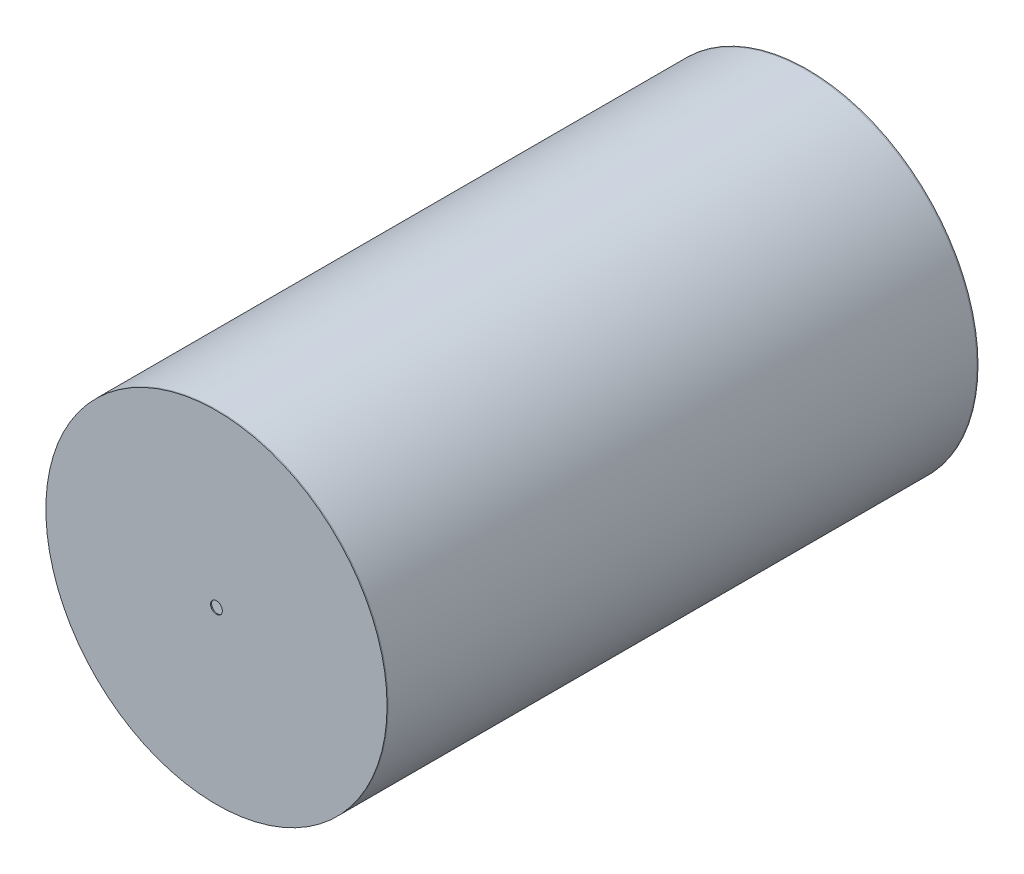
ISO-10303-21;
HEADER;
FILE_DESCRIPTION(('STEP AP214'),'2;1');
FILE_NAME('part.step','',(''),(''),'','','');
FILE_SCHEMA(('AUTOMOTIVE_DESIGN { 1 0 10303 214 1 1 1 1 }'));
ENDSEC;
DATA;
#1=APPLICATION_CONTEXT('core data for automotive mechanical design processes');
#2=APPLICATION_PROTOCOL_DEFINITION('international standard','automotive_design',2000,#1);
#3=PRODUCT_CONTEXT('',#1,'mechanical');
#4=PRODUCT('Part','Part','',(#3));
#5=PRODUCT_RELATED_PRODUCT_CATEGORY('part','',(#4));
#6=PRODUCT_DEFINITION_FORMATION('','',#4);
#7=PRODUCT_DEFINITION_CONTEXT('part definition',#1,'design');
#8=PRODUCT_DEFINITION('design','',#6,#7);
#9=PRODUCT_DEFINITION_SHAPE('','',#8);
#10=(LENGTH_UNIT() NAMED_UNIT(*) SI_UNIT(.MILLI.,.METRE.));
#11=(NAMED_UNIT(*) PLANE_ANGLE_UNIT() SI_UNIT($,.RADIAN.));
#12=(NAMED_UNIT(*) SI_UNIT($,.STERADIAN.) SOLID_ANGLE_UNIT());
#13=UNCERTAINTY_MEASURE_WITH_UNIT(LENGTH_MEASURE(1.E-05),#10,'distance_accuracy_value','');
#14=(GEOMETRIC_REPRESENTATION_CONTEXT(3) GLOBAL_UNCERTAINTY_ASSIGNED_CONTEXT((#13)) GLOBAL_UNIT_ASSIGNED_CONTEXT((#10,
#11,#12)) REPRESENTATION_CONTEXT('',''));
#15=CARTESIAN_POINT('',(0.,0.,0.));
#16=DIRECTION('',(0.,0.,1.));
#17=DIRECTION('',(1.,0.,0.));
#18=AXIS2_PLACEMENT_3D('',#15,#16,#17);
#19=CARTESIAN_POINT('',(0.,0.,1149.92));
#20=DIRECTION('',(0.,0.,-1.));
#21=DIRECTION('',(-1.,0.,0.));
#22=AXIS2_PLACEMENT_3D('',#19,#20,#21);
#23=CYLINDRICAL_SURFACE('',#22,332.);
#24=CARTESIAN_POINT('',(0.,0.,1149.92));
#25=DIRECTION('',(0.,0.,1.));
#26=DIRECTION('',(1.,0.,0.));
#27=AXIS2_PLACEMENT_3D('',#24,#25,#26);
#28=CIRCLE('',#27,332.);
#29=CARTESIAN_POINT('',(332.,0.,1149.92));
#30=VERTEX_POINT('',#29);
#31=EDGE_CURVE('E11',#30,#30,#28,.T.);
#32=ORIENTED_EDGE('',*,*,#31,.F.);
#33=EDGE_LOOP('',(#32));
#34=FACE_BOUND('',#33,.T.);
#35=CARTESIAN_POINT('',(0.,0.,1147.92));
#36=DIRECTION('',(0.,0.,1.));
#37=DIRECTION('',(1.,0.,0.));
#38=AXIS2_PLACEMENT_3D('',#35,#36,#37);
#39=CIRCLE('',#38,332.);
#40=CARTESIAN_POINT('',(332.,0.,1147.92));
#41=VERTEX_POINT('',#40);
#42=EDGE_CURVE('E43',#41,#41,#39,.T.);
#43=ORIENTED_EDGE('',*,*,#42,.T.);
#44=EDGE_LOOP('',(#43));
#45=FACE_BOUND('',#44,.T.);
#46=ADVANCED_FACE('F40',(#34,#45),#23,.T.);
#47=CARTESIAN_POINT('',(0.,0.,1149.92));
#48=DIRECTION('',(0.,0.,1.));
#49=DIRECTION('',(1.,0.,0.));
#50=AXIS2_PLACEMENT_3D('',#47,#48,#49);
#51=PLANE('',#50);
#52=CARTESIAN_POINT('',(0.,0.,1149.92));
#53=DIRECTION('',(0.,0.,1.));
#54=DIRECTION('',(1.,0.,0.));
#55=AXIS2_PLACEMENT_3D('',#52,#53,#54);
#56=CIRCLE('',#55,11.45);
#57=CARTESIAN_POINT('',(11.45,0.,1149.92));
#58=VERTEX_POINT('',#57);
#59=EDGE_CURVE('E54',#58,#58,#56,.T.);
#60=ORIENTED_EDGE('',*,*,#59,.F.);
#61=EDGE_LOOP('',(#60));
#62=FACE_BOUND('',#61,.T.);
#63=ORIENTED_EDGE('',*,*,#31,.T.);
#64=EDGE_LOOP('',(#63));
#65=FACE_BOUND('',#64,.T.);
#66=ADVANCED_FACE('F61',(#62,#65),#51,.T.);
#67=CARTESIAN_POINT('',(0.,0.,1147.92));
#68=DIRECTION('',(0.,0.,1.));
#69=DIRECTION('',(1.,0.,0.));
#70=AXIS2_PLACEMENT_3D('',#67,#68,#69);
#71=PLANE('',#70);
#72=CARTESIAN_POINT('',(0.,0.,1147.92));
#73=DIRECTION('',(0.,0.,1.));
#74=DIRECTION('',(1.,0.,0.));
#75=AXIS2_PLACEMENT_3D('',#72,#73,#74);
#76=CIRCLE('',#75,11.45);
#77=CARTESIAN_POINT('',(11.45,0.,1147.92));
#78=VERTEX_POINT('',#77);
#79=EDGE_CURVE('E50',#78,#78,#76,.F.);
#80=ORIENTED_EDGE('',*,*,#79,.F.);
#81=EDGE_LOOP('',(#80));
#82=FACE_BOUND('',#81,.T.);
#83=ORIENTED_EDGE('',*,*,#42,.F.);
#84=EDGE_LOOP('',(#83));
#85=FACE_BOUND('',#84,.T.);
#86=ADVANCED_FACE('F63',(#82,#85),#71,.F.);
#87=CARTESIAN_POINT('',(0.,0.,-0.000999999999917733));
#88=DIRECTION('',(0.,0.,1.));
#89=DIRECTION('',(1.,0.,0.));
#90=AXIS2_PLACEMENT_3D('',#87,#88,#89);
#91=CYLINDRICAL_SURFACE('',#90,11.45);
#92=ORIENTED_EDGE('',*,*,#59,.T.);
#93=EDGE_LOOP('',(#92));
#94=FACE_BOUND('',#93,.T.);
#95=ORIENTED_EDGE('',*,*,#79,.T.);
#96=EDGE_LOOP('',(#95));
#97=FACE_BOUND('',#96,.T.);
#98=ADVANCED_FACE('F58',(#94,#97),#91,.F.);
#99=CLOSED_SHELL('',(#46,#66,#86,#98));
#100=MANIFOLD_SOLID_BREP('B2',#99);
#101=CARTESIAN_POINT('',(0.,0.,1147.92));
#102=DIRECTION('',(0.,0.,1.));
#103=DIRECTION('',(1.,0.,0.));
#104=AXIS2_PLACEMENT_3D('',#101,#102,#103);
#105=PLANE('',#104);
#106=CARTESIAN_POINT('',(0.,0.,1147.92));
#107=DIRECTION('',(0.,0.,1.));
#108=DIRECTION('',(1.,0.,0.));
#109=AXIS2_PLACEMENT_3D('',#106,#107,#108);
#110=CIRCLE('',#109,332.);
#111=CARTESIAN_POINT('',(332.,0.,1147.92));
#112=VERTEX_POINT('',#111);
#113=EDGE_CURVE('E39',#112,#112,#110,.T.);
#114=ORIENTED_EDGE('',*,*,#113,.T.);
#115=EDGE_LOOP('',(#114));
#116=FACE_BOUND('',#115,.T.);
#117=CARTESIAN_POINT('',(0.,0.,1147.92));
#118=DIRECTION('',(0.,0.,1.));
#119=DIRECTION('',(1.,0.,0.));
#120=AXIS2_PLACEMENT_3D('',#117,#118,#119);
#121=CIRCLE('',#120,330.);
#122=CARTESIAN_POINT('',(330.,0.,1147.92));
#123=VERTEX_POINT('',#122);
#124=EDGE_CURVE('E120',#123,#123,#121,.T.);
#125=ORIENTED_EDGE('',*,*,#124,.F.);
#126=EDGE_LOOP('',(#125));
#127=FACE_BOUND('',#126,.T.);
#128=ADVANCED_FACE('F109',(#116,#127),#105,.T.);
#129=CARTESIAN_POINT('',(0.,0.,2.));
#130=DIRECTION('',(0.,0.,1.));
#131=DIRECTION('',(1.,0.,0.));
#132=AXIS2_PLACEMENT_3D('',#129,#130,#131);
#133=PLANE('',#132);
#134=CARTESIAN_POINT('',(0.,0.,2.));
#135=DIRECTION('',(0.,0.,1.));
#136=DIRECTION('',(1.,0.,0.));
#137=AXIS2_PLACEMENT_3D('',#134,#135,#136);
#138=CIRCLE('',#137,332.);
#139=CARTESIAN_POINT('',(332.,0.,2.));
#140=VERTEX_POINT('',#139);
#141=EDGE_CURVE('E113',#140,#140,#138,.T.);
#142=ORIENTED_EDGE('',*,*,#141,.F.);
#143=EDGE_LOOP('',(#142));
#144=FACE_BOUND('',#143,.T.);
#145=CARTESIAN_POINT('',(0.,0.,2.));
#146=DIRECTION('',(0.,0.,1.));
#147=DIRECTION('',(1.,0.,0.));
#148=AXIS2_PLACEMENT_3D('',#145,#146,#147);
#149=CIRCLE('',#148,330.);
#150=CARTESIAN_POINT('',(330.,0.,2.));
#151=VERTEX_POINT('',#150);
#152=EDGE_CURVE('E122',#151,#151,#149,.T.);
#153=ORIENTED_EDGE('',*,*,#152,.T.);
#154=EDGE_LOOP('',(#153));
#155=FACE_BOUND('',#154,.T.);
#156=ADVANCED_FACE('F132',(#144,#155),#133,.F.);
#157=CARTESIAN_POINT('',(0.,0.,1147.92));
#158=DIRECTION('',(0.,0.,-1.));
#159=DIRECTION('',(-1.,0.,0.));
#160=AXIS2_PLACEMENT_3D('',#157,#158,#159);
#161=CYLINDRICAL_SURFACE('',#160,332.);
#162=ORIENTED_EDGE('',*,*,#113,.F.);
#163=EDGE_LOOP('',(#162));
#164=FACE_BOUND('',#163,.T.);
#165=ORIENTED_EDGE('',*,*,#141,.T.);
#166=EDGE_LOOP('',(#165));
#167=FACE_BOUND('',#166,.T.);
#168=ADVANCED_FACE('F111',(#164,#167),#161,.T.);
#169=CARTESIAN_POINT('',(0.,0.,1147.92));
#170=DIRECTION('',(0.,0.,-1.));
#171=DIRECTION('',(-1.,0.,0.));
#172=AXIS2_PLACEMENT_3D('',#169,#170,#171);
#173=CYLINDRICAL_SURFACE('',#172,330.);
#174=ORIENTED_EDGE('',*,*,#124,.T.);
#175=EDGE_LOOP('',(#174));
#176=FACE_BOUND('',#175,.T.);
#177=ORIENTED_EDGE('',*,*,#152,.F.);
#178=EDGE_LOOP('',(#177));
#179=FACE_BOUND('',#178,.T.);
#180=ADVANCED_FACE('F128',(#176,#179),#173,.F.);
#181=CLOSED_SHELL('',(#128,#156,#168,#180));
#182=MANIFOLD_SOLID_BREP('B6',#181);
#183=CARTESIAN_POINT('',(0.,0.,2.));
#184=DIRECTION('',(0.,0.,-1.));
#185=DIRECTION('',(-1.,0.,0.));
#186=AXIS2_PLACEMENT_3D('',#183,#184,#185);
#187=CYLINDRICAL_SURFACE('',#186,332.);
#188=CARTESIAN_POINT('',(0.,0.,2.));
#189=DIRECTION('',(0.,0.,1.));
#190=DIRECTION('',(1.,0.,0.));
#191=AXIS2_PLACEMENT_3D('',#188,#189,#190);
#192=CIRCLE('',#191,332.);
#193=CARTESIAN_POINT('',(332.,0.,2.));
#194=VERTEX_POINT('',#193);
#195=EDGE_CURVE('E108',#194,#194,#192,.T.);
#196=ORIENTED_EDGE('',*,*,#195,.F.);
#197=EDGE_LOOP('',(#196));
#198=FACE_BOUND('',#197,.T.);
#199=CARTESIAN_POINT('',(0.,0.,0.));
#200=DIRECTION('',(0.,0.,1.));
#201=DIRECTION('',(1.,0.,0.));
#202=AXIS2_PLACEMENT_3D('',#199,#200,#201);
#203=CIRCLE('',#202,332.);
#204=CARTESIAN_POINT('',(332.,0.,0.));
#205=VERTEX_POINT('',#204);
#206=EDGE_CURVE('E174',#205,#205,#203,.T.);
#207=ORIENTED_EDGE('',*,*,#206,.T.);
#208=EDGE_LOOP('',(#207));
#209=FACE_BOUND('',#208,.T.);
#210=ADVANCED_FACE('F171',(#198,#209),#187,.T.);
#211=CARTESIAN_POINT('',(0.,0.,2.));
#212=DIRECTION('',(0.,0.,1.));
#213=DIRECTION('',(1.,0.,0.));
#214=AXIS2_PLACEMENT_3D('',#211,#212,#213);
#215=PLANE('',#214);
#216=ORIENTED_EDGE('',*,*,#195,.T.);
#217=EDGE_LOOP('',(#216));
#218=FACE_BOUND('',#217,.T.);
#219=ADVANCED_FACE('F186',(#218),#215,.T.);
#220=CARTESIAN_POINT('',(0.,0.,0.));
#221=DIRECTION('',(0.,0.,1.));
#222=DIRECTION('',(1.,0.,0.));
#223=AXIS2_PLACEMENT_3D('',#220,#221,#222);
#224=PLANE('',#223);
#225=ORIENTED_EDGE('',*,*,#206,.F.);
#226=EDGE_LOOP('',(#225));
#227=FACE_BOUND('',#226,.T.);
#228=ADVANCED_FACE('F184',(#227),#224,.F.);
#229=CLOSED_SHELL('',(#210,#219,#228));
#230=MANIFOLD_SOLID_BREP('B34',#229);
#231=ADVANCED_BREP_SHAPE_REPRESENTATION('',(#18,#100,#182,#230),#14);
#232=SHAPE_DEFINITION_REPRESENTATION(#9,#231);
ENDSEC;
END-ISO-10303-21;
